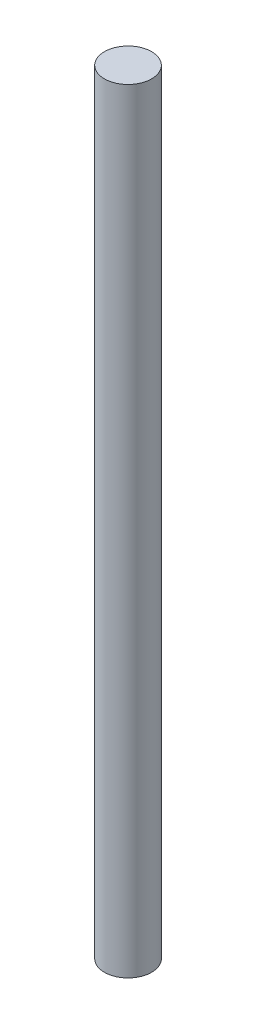
ISO-10303-21;
HEADER;
FILE_DESCRIPTION(('STEP AP214'),'2;1');
FILE_NAME('part.step','',(''),(''),'','','');
FILE_SCHEMA(('AUTOMOTIVE_DESIGN { 1 0 10303 214 1 1 1 1 }'));
ENDSEC;
DATA;
#1=APPLICATION_CONTEXT('core data for automotive mechanical design processes');
#2=APPLICATION_PROTOCOL_DEFINITION('international standard','automotive_design',2000,#1);
#3=PRODUCT_CONTEXT('',#1,'mechanical');
#4=PRODUCT('Part','Part','',(#3));
#5=PRODUCT_RELATED_PRODUCT_CATEGORY('part','',(#4));
#6=PRODUCT_DEFINITION_FORMATION('','',#4);
#7=PRODUCT_DEFINITION_CONTEXT('part definition',#1,'design');
#8=PRODUCT_DEFINITION('design','',#6,#7);
#9=PRODUCT_DEFINITION_SHAPE('','',#8);
#10=(LENGTH_UNIT() NAMED_UNIT(*) SI_UNIT(.MILLI.,.METRE.));
#11=(NAMED_UNIT(*) PLANE_ANGLE_UNIT() SI_UNIT($,.RADIAN.));
#12=(NAMED_UNIT(*) SI_UNIT($,.STERADIAN.) SOLID_ANGLE_UNIT());
#13=UNCERTAINTY_MEASURE_WITH_UNIT(LENGTH_MEASURE(1.E-05),#10,'distance_accuracy_value','');
#14=(GEOMETRIC_REPRESENTATION_CONTEXT(3) GLOBAL_UNCERTAINTY_ASSIGNED_CONTEXT((#13)) GLOBAL_UNIT_ASSIGNED_CONTEXT((#10,
#11,#12)) REPRESENTATION_CONTEXT('',''));
#15=CARTESIAN_POINT('',(0.,0.,0.));
#16=DIRECTION('',(0.,0.,1.));
#17=DIRECTION('',(1.,0.,0.));
#18=AXIS2_PLACEMENT_3D('',#15,#16,#17);
#19=CARTESIAN_POINT('',(2.5,-100.,0.));
#20=DIRECTION('',(0.,-1.,0.));
#21=DIRECTION('',(0.,0.,-1.));
#22=AXIS2_PLACEMENT_3D('',#19,#20,#21);
#23=PLANE('',#22);
#24=CARTESIAN_POINT('',(0.,-100.,0.));
#25=DIRECTION('',(0.,-1.,0.));
#26=DIRECTION('',(0.,0.,-1.));
#27=AXIS2_PLACEMENT_3D('',#24,#25,#26);
#28=CIRCLE('',#27,2.5);
#29=CARTESIAN_POINT('',(0.,-100.,-2.5));
#30=VERTEX_POINT('',#29);
#31=EDGE_CURVE('E41',#30,#30,#28,.T.);
#32=ORIENTED_EDGE('',*,*,#31,.T.);
#33=EDGE_LOOP('',(#32));
#34=FACE_BOUND('',#33,.T.);
#35=ADVANCED_FACE('F35',(#34),#23,.T.);
#36=CARTESIAN_POINT('',(0.,-18.,0.));
#37=DIRECTION('',(0.,1.,0.));
#38=DIRECTION('',(0.,0.,1.));
#39=AXIS2_PLACEMENT_3D('',#36,#37,#38);
#40=PLANE('',#39);
#41=CARTESIAN_POINT('',(0.,-18.,0.));
#42=DIRECTION('',(0.,-1.,0.));
#43=DIRECTION('',(0.,0.,-1.));
#44=AXIS2_PLACEMENT_3D('',#41,#42,#43);
#45=CIRCLE('',#44,2.5);
#46=CARTESIAN_POINT('',(0.,-18.,-2.5));
#47=VERTEX_POINT('',#46);
#48=EDGE_CURVE('E10',#47,#47,#45,.T.);
#49=ORIENTED_EDGE('',*,*,#48,.F.);
#50=EDGE_LOOP('',(#49));
#51=FACE_BOUND('',#50,.T.);
#52=ADVANCED_FACE('F50',(#51),#40,.T.);
#53=CARTESIAN_POINT('',(0.,-200.,0.));
#54=DIRECTION('',(0.,-1.,0.));
#55=DIRECTION('',(0.,0.,-1.));
#56=AXIS2_PLACEMENT_3D('',#53,#54,#55);
#57=CYLINDRICAL_SURFACE('',#56,2.5);
#58=ORIENTED_EDGE('',*,*,#48,.T.);
#59=EDGE_LOOP('',(#58));
#60=FACE_BOUND('',#59,.T.);
#61=ORIENTED_EDGE('',*,*,#31,.F.);
#62=EDGE_LOOP('',(#61));
#63=FACE_BOUND('',#62,.T.);
#64=ADVANCED_FACE('F48',(#60,#63),#57,.T.);
#65=CLOSED_SHELL('',(#35,#52,#64));
#66=MANIFOLD_SOLID_BREP('B2',#65);
#67=ADVANCED_BREP_SHAPE_REPRESENTATION('',(#18,#66),#14);
#68=SHAPE_DEFINITION_REPRESENTATION(#9,#67);
ENDSEC;
END-ISO-10303-21;
